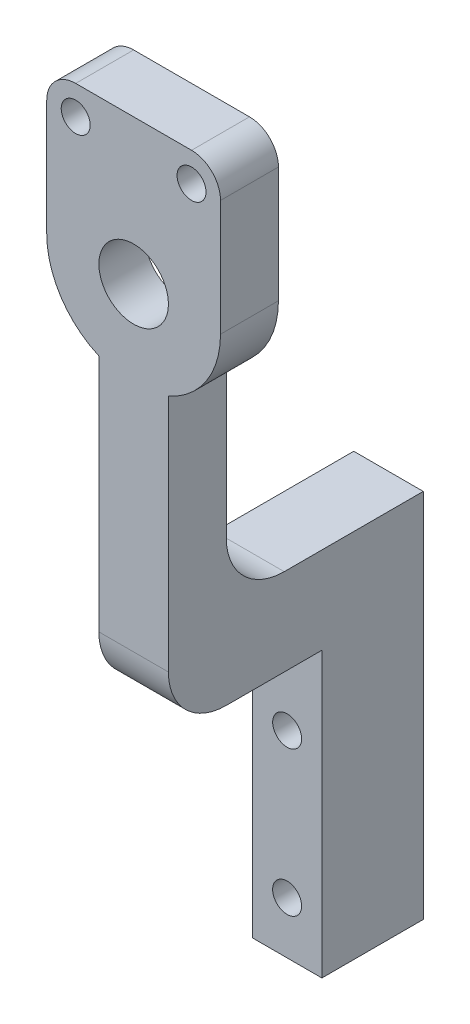
ISO-10303-21;
HEADER;
FILE_DESCRIPTION(('STEP AP214'),'2;1');
FILE_NAME('part.step','',(''),(''),'','','');
FILE_SCHEMA(('AUTOMOTIVE_DESIGN { 1 0 10303 214 1 1 1 1 }'));
ENDSEC;
DATA;
#1=APPLICATION_CONTEXT('core data for automotive mechanical design processes');
#2=APPLICATION_PROTOCOL_DEFINITION('international standard','automotive_design',2000,#1);
#3=PRODUCT_CONTEXT('',#1,'mechanical');
#4=PRODUCT('Part','Part','',(#3));
#5=PRODUCT_RELATED_PRODUCT_CATEGORY('part','',(#4));
#6=PRODUCT_DEFINITION_FORMATION('','',#4);
#7=PRODUCT_DEFINITION_CONTEXT('part definition',#1,'design');
#8=PRODUCT_DEFINITION('design','',#6,#7);
#9=PRODUCT_DEFINITION_SHAPE('','',#8);
#10=(LENGTH_UNIT() NAMED_UNIT(*) SI_UNIT(.MILLI.,.METRE.));
#11=(NAMED_UNIT(*) PLANE_ANGLE_UNIT() SI_UNIT($,.RADIAN.));
#12=(NAMED_UNIT(*) SI_UNIT($,.STERADIAN.) SOLID_ANGLE_UNIT());
#13=UNCERTAINTY_MEASURE_WITH_UNIT(LENGTH_MEASURE(1.E-05),#10,'distance_accuracy_value','');
#14=(GEOMETRIC_REPRESENTATION_CONTEXT(3) GLOBAL_UNCERTAINTY_ASSIGNED_CONTEXT((#13)) GLOBAL_UNIT_ASSIGNED_CONTEXT((#10,
#11,#12)) REPRESENTATION_CONTEXT('',''));
#15=CARTESIAN_POINT('',(0.,0.,0.));
#16=DIRECTION('',(0.,0.,1.));
#17=DIRECTION('',(1.,0.,0.));
#18=AXIS2_PLACEMENT_3D('',#15,#16,#17);
#19=CARTESIAN_POINT('',(-6.,80.,0.));
#20=DIRECTION('',(1.,0.,0.));
#21=DIRECTION('',(0.,0.,-1.));
#22=AXIS2_PLACEMENT_3D('',#19,#20,#21);
#23=PLANE('',#22);
#24=DIRECTION('',(0.,-1.,0.));
#25=VECTOR('',#24,1.);
#26=CARTESIAN_POINT('',(-6.,0.,35.));
#27=LINE('',#26,#25);
#28=CARTESIAN_POINT('',(-6.,80.,35.));
#29=VERTEX_POINT('',#28);
#30=CARTESIAN_POINT('',(-6.,16.,35.));
#31=VERTEX_POINT('',#30);
#32=EDGE_CURVE('E90',#29,#31,#27,.T.);
#33=ORIENTED_EDGE('',*,*,#32,.T.);
#34=DIRECTION('',(0.,0.,1.));
#35=VECTOR('',#34,1.);
#36=CARTESIAN_POINT('',(-6.,16.,0.));
#37=LINE('',#36,#35);
#38=CARTESIAN_POINT('',(-6.,16.,52.5));
#39=VERTEX_POINT('',#38);
#40=EDGE_CURVE('E83',#31,#39,#37,.T.);
#41=ORIENTED_EDGE('',*,*,#40,.T.);
#42=DIRECTION('',(0.,-1.,0.));
#43=VECTOR('',#42,1.);
#44=CARTESIAN_POINT('',(-6.,80.,52.5));
#45=LINE('',#44,#43);
#46=CARTESIAN_POINT('',(-6.,65.,52.5));
#47=VERTEX_POINT('',#46);
#48=EDGE_CURVE('E286',#47,#39,#45,.T.);
#49=ORIENTED_EDGE('',*,*,#48,.F.);
#50=DIRECTION('',(0.,0.,-1.));
#51=VECTOR('',#50,1.);
#52=CARTESIAN_POINT('',(-6.,65.,0.));
#53=LINE('',#52,#51);
#54=CARTESIAN_POINT('',(-6.,65.,68.9999999999999));
#55=VERTEX_POINT('',#54);
#56=EDGE_CURVE('E244',#55,#47,#53,.T.);
#57=ORIENTED_EDGE('',*,*,#56,.F.);
#58=CARTESIAN_POINT('',(-6.,75.,69.));
#59=DIRECTION('',(-1.,0.,0.));
#60=DIRECTION('',(0.,0.,1.));
#61=AXIS2_PLACEMENT_3D('',#58,#59,#60);
#62=CIRCLE('',#61,9.99999999999999);
#63=CARTESIAN_POINT('',(-6.,75.0000000000001,79.));
#64=VERTEX_POINT('',#63);
#65=EDGE_CURVE('E238',#64,#55,#62,.F.);
#66=ORIENTED_EDGE('',*,*,#65,.F.);
#67=DIRECTION('',(0.,-1.,0.));
#68=VECTOR('',#67,1.);
#69=CARTESIAN_POINT('',(-6.,0.,79.));
#70=LINE('',#69,#68);
#71=CARTESIAN_POINT('',(-6.,116.252272915133,79.));
#72=VERTEX_POINT('',#71);
#73=EDGE_CURVE('E204',#72,#64,#70,.T.);
#74=ORIENTED_EDGE('',*,*,#73,.F.);
#75=DIRECTION('',(0.,0.,-1.));
#76=VECTOR('',#75,1.);
#77=CARTESIAN_POINT('',(-6.,116.252272915133,120.550352736722));
#78=LINE('',#77,#76);
#79=CARTESIAN_POINT('',(-6.,116.252272915133,69.));
#80=VERTEX_POINT('',#79);
#81=EDGE_CURVE('E201',#72,#80,#78,.T.);
#82=ORIENTED_EDGE('',*,*,#81,.T.);
#83=DIRECTION('',(0.,1.,0.));
#84=VECTOR('',#83,1.);
#85=CARTESIAN_POINT('',(-6.,0.,69.));
#86=LINE('',#85,#84);
#87=CARTESIAN_POINT('',(-6.,90.0000000000001,69.));
#88=VERTEX_POINT('',#87);
#89=EDGE_CURVE('E261',#88,#80,#86,.T.);
#90=ORIENTED_EDGE('',*,*,#89,.F.);
#91=CARTESIAN_POINT('',(-6.,90.,59.));
#92=DIRECTION('',(-1.,0.,0.));
#93=DIRECTION('',(0.,0.,1.));
#94=AXIS2_PLACEMENT_3D('',#91,#92,#93);
#95=CIRCLE('',#94,10.);
#96=CARTESIAN_POINT('',(-6.,80.,59.));
#97=VERTEX_POINT('',#96);
#98=EDGE_CURVE('E258',#88,#97,#95,.F.);
#99=ORIENTED_EDGE('',*,*,#98,.T.);
#100=DIRECTION('',(0.,0.,1.));
#101=VECTOR('',#100,1.);
#102=CARTESIAN_POINT('',(-6.,80.,0.));
#103=LINE('',#102,#101);
#104=EDGE_CURVE('E294',#29,#97,#103,.T.);
#105=ORIENTED_EDGE('',*,*,#104,.F.);
#106=EDGE_LOOP('',(#33,#41,#49,#57,#66,#74,#82,#90,#99,#105));
#107=FACE_BOUND('',#106,.T.);
#108=ADVANCED_FACE('F68',(#107),#23,.F.);
#109=CARTESIAN_POINT('',(6.,80.,0.));
#110=DIRECTION('',(-1.,0.,0.));
#111=DIRECTION('',(0.,0.,1.));
#112=AXIS2_PLACEMENT_3D('',#109,#110,#111);
#113=PLANE('',#112);
#114=DIRECTION('',(0.,-1.,0.));
#115=VECTOR('',#114,1.);
#116=CARTESIAN_POINT('',(6.,80.,52.5));
#117=LINE('',#116,#115);
#118=CARTESIAN_POINT('',(6.00000000000001,65.,52.5));
#119=VERTEX_POINT('',#118);
#120=CARTESIAN_POINT('',(6.,16.,52.5));
#121=VERTEX_POINT('',#120);
#122=EDGE_CURVE('E305',#119,#121,#117,.T.);
#123=ORIENTED_EDGE('',*,*,#122,.T.);
#124=DIRECTION('',(0.,0.,-1.));
#125=VECTOR('',#124,1.);
#126=CARTESIAN_POINT('',(6.,16.,0.));
#127=LINE('',#126,#125);
#128=CARTESIAN_POINT('',(6.,16.,35.));
#129=VERTEX_POINT('',#128);
#130=EDGE_CURVE('E389',#121,#129,#127,.T.);
#131=ORIENTED_EDGE('',*,*,#130,.T.);
#132=DIRECTION('',(0.,-1.,0.));
#133=VECTOR('',#132,1.);
#134=CARTESIAN_POINT('',(6.,0.,35.));
#135=LINE('',#134,#133);
#136=CARTESIAN_POINT('',(6.,80.,35.));
#137=VERTEX_POINT('',#136);
#138=EDGE_CURVE('E76',#137,#129,#135,.T.);
#139=ORIENTED_EDGE('',*,*,#138,.F.);
#140=DIRECTION('',(0.,0.,-1.));
#141=VECTOR('',#140,1.);
#142=CARTESIAN_POINT('',(6.,80.,0.));
#143=LINE('',#142,#141);
#144=CARTESIAN_POINT('',(6.00000000000001,80.,59.));
#145=VERTEX_POINT('',#144);
#146=EDGE_CURVE('E386',#145,#137,#143,.T.);
#147=ORIENTED_EDGE('',*,*,#146,.F.);
#148=CARTESIAN_POINT('',(6.00000000000001,90.,59.));
#149=DIRECTION('',(-1.,0.,0.));
#150=DIRECTION('',(0.,0.,1.));
#151=AXIS2_PLACEMENT_3D('',#148,#149,#150);
#152=CIRCLE('',#151,10.);
#153=CARTESIAN_POINT('',(6.00000000000001,90.,69.));
#154=VERTEX_POINT('',#153);
#155=EDGE_CURVE('E277',#145,#154,#152,.T.);
#156=ORIENTED_EDGE('',*,*,#155,.T.);
#157=DIRECTION('',(0.,-1.,0.));
#158=VECTOR('',#157,1.);
#159=CARTESIAN_POINT('',(6.00000000000001,0.,69.));
#160=LINE('',#159,#158);
#161=CARTESIAN_POINT('',(6.00000000000001,116.252272915133,69.));
#162=VERTEX_POINT('',#161);
#163=EDGE_CURVE('E229',#162,#154,#160,.T.);
#164=ORIENTED_EDGE('',*,*,#163,.F.);
#165=DIRECTION('',(0.,0.,-1.));
#166=VECTOR('',#165,1.);
#167=CARTESIAN_POINT('',(6.00000000000001,116.252272915133,120.550352736722));
#168=LINE('',#167,#166);
#169=CARTESIAN_POINT('',(6.00000000000001,116.252272915133,79.));
#170=VERTEX_POINT('',#169);
#171=EDGE_CURVE('E287',#170,#162,#168,.T.);
#172=ORIENTED_EDGE('',*,*,#171,.F.);
#173=DIRECTION('',(0.,1.,0.));
#174=VECTOR('',#173,1.);
#175=CARTESIAN_POINT('',(6.00000000000001,0.,79.));
#176=LINE('',#175,#174);
#177=CARTESIAN_POINT('',(6.00000000000001,75.,79.));
#178=VERTEX_POINT('',#177);
#179=EDGE_CURVE('E209',#178,#170,#176,.T.);
#180=ORIENTED_EDGE('',*,*,#179,.F.);
#181=CARTESIAN_POINT('',(6.00000000000001,75.,69.));
#182=DIRECTION('',(-1.,0.,0.));
#183=DIRECTION('',(0.,0.,1.));
#184=AXIS2_PLACEMENT_3D('',#181,#182,#183);
#185=CIRCLE('',#184,9.99999999999999);
#186=CARTESIAN_POINT('',(6.00000000000001,65.,68.9999999999999));
#187=VERTEX_POINT('',#186);
#188=EDGE_CURVE('E223',#187,#178,#185,.T.);
#189=ORIENTED_EDGE('',*,*,#188,.F.);
#190=DIRECTION('',(0.,0.,1.));
#191=VECTOR('',#190,1.);
#192=CARTESIAN_POINT('',(6.00000000000001,65.,0.));
#193=LINE('',#192,#191);
#194=EDGE_CURVE('E234',#119,#187,#193,.T.);
#195=ORIENTED_EDGE('',*,*,#194,.F.);
#196=EDGE_LOOP('',(#123,#131,#139,#147,#156,#164,#172,#180,#189,#195));
#197=FACE_BOUND('',#196,.T.);
#198=ADVANCED_FACE('F384',(#197),#113,.F.);
#199=CARTESIAN_POINT('',(0.,130.,120.550352736722));
#200=DIRECTION('',(0.,0.,-1.));
#201=DIRECTION('',(-1.,0.,0.));
#202=AXIS2_PLACEMENT_3D('',#199,#200,#201);
#203=CYLINDRICAL_SURFACE('',#202,15.);
#204=CARTESIAN_POINT('',(0.,130.,69.));
#205=DIRECTION('',(0.,0.,-1.));
#206=DIRECTION('',(-1.,0.,0.));
#207=AXIS2_PLACEMENT_3D('',#204,#205,#206);
#208=CIRCLE('',#207,15.);
#209=CARTESIAN_POINT('',(15.,130.,69.));
#210=VERTEX_POINT('',#209);
#211=EDGE_CURVE('E271',#210,#162,#208,.T.);
#212=ORIENTED_EDGE('',*,*,#211,.F.);
#213=DIRECTION('',(0.,0.,1.));
#214=VECTOR('',#213,1.);
#215=CARTESIAN_POINT('',(15.,130.,29.9487516204667));
#216=LINE('',#215,#214);
#217=CARTESIAN_POINT('',(15.,130.,79.));
#218=VERTEX_POINT('',#217);
#219=EDGE_CURVE('E297',#210,#218,#216,.T.);
#220=ORIENTED_EDGE('',*,*,#219,.T.);
#221=CARTESIAN_POINT('',(0.,130.,79.));
#222=DIRECTION('',(0.,0.,-1.));
#223=DIRECTION('',(0.,1.,0.));
#224=AXIS2_PLACEMENT_3D('',#221,#222,#223);
#225=CIRCLE('',#224,15.);
#226=EDGE_CURVE('E206',#170,#218,#225,.F.);
#227=ORIENTED_EDGE('',*,*,#226,.F.);
#228=ORIENTED_EDGE('',*,*,#171,.T.);
#229=EDGE_LOOP('',(#212,#220,#227,#228));
#230=FACE_BOUND('',#229,.T.);
#231=ADVANCED_FACE('F449',(#230),#203,.T.);
#232=CARTESIAN_POINT('',(0.,80.,52.5));
#233=DIRECTION('',(0.,0.,-1.));
#234=DIRECTION('',(-1.,0.,0.));
#235=AXIS2_PLACEMENT_3D('',#232,#233,#234);
#236=PLANE('',#235);
#237=CARTESIAN_POINT('',(0.,25.,52.5));
#238=DIRECTION('',(0.,0.,-1.));
#239=DIRECTION('',(-1.,0.,0.));
#240=AXIS2_PLACEMENT_3D('',#237,#238,#239);
#241=CIRCLE('',#240,2.5);
#242=CARTESIAN_POINT('',(-2.5,25.,52.5));
#243=VERTEX_POINT('',#242);
#244=EDGE_CURVE('E361',#243,#243,#241,.F.);
#245=ORIENTED_EDGE('',*,*,#244,.F.);
#246=EDGE_LOOP('',(#245));
#247=FACE_BOUND('',#246,.T.);
#248=CARTESIAN_POINT('',(0.,50.,52.5));
#249=DIRECTION('',(0.,0.,-1.));
#250=DIRECTION('',(-1.,0.,0.));
#251=AXIS2_PLACEMENT_3D('',#248,#249,#250);
#252=CIRCLE('',#251,2.5);
#253=CARTESIAN_POINT('',(-2.5,50.,52.5));
#254=VERTEX_POINT('',#253);
#255=EDGE_CURVE('E356',#254,#254,#252,.F.);
#256=ORIENTED_EDGE('',*,*,#255,.F.);
#257=EDGE_LOOP('',(#256));
#258=FACE_BOUND('',#257,.T.);
#259=ORIENTED_EDGE('',*,*,#48,.T.);
#260=DIRECTION('',(1.,0.,0.));
#261=VECTOR('',#260,1.);
#262=CARTESIAN_POINT('',(0.,16.,52.5));
#263=LINE('',#262,#261);
#264=EDGE_CURVE('E419',#39,#121,#263,.T.);
#265=ORIENTED_EDGE('',*,*,#264,.T.);
#266=ORIENTED_EDGE('',*,*,#122,.F.);
#267=DIRECTION('',(-1.,0.,0.));
#268=VECTOR('',#267,1.);
#269=CARTESIAN_POINT('',(76.1943729938519,65.,52.5));
#270=LINE('',#269,#268);
#271=EDGE_CURVE('E283',#119,#47,#270,.T.);
#272=ORIENTED_EDGE('',*,*,#271,.T.);
#273=EDGE_LOOP('',(#259,#265,#266,#272));
#274=FACE_BOUND('',#273,.T.);
#275=ADVANCED_FACE('F434',(#247,#258,#274),#236,.F.);
#276=CARTESIAN_POINT('',(0.,80.,0.));
#277=DIRECTION('',(0.,1.,0.));
#278=DIRECTION('',(0.,0.,1.));
#279=AXIS2_PLACEMENT_3D('',#276,#277,#278);
#280=PLANE('',#279);
#281=DIRECTION('',(1.,0.,0.));
#282=VECTOR('',#281,1.);
#283=CARTESIAN_POINT('',(0.,80.,35.));
#284=LINE('',#283,#282);
#285=EDGE_CURVE('E365',#29,#137,#284,.T.);
#286=ORIENTED_EDGE('',*,*,#285,.F.);
#287=ORIENTED_EDGE('',*,*,#104,.T.);
#288=DIRECTION('',(-1.,0.,0.));
#289=VECTOR('',#288,1.);
#290=CARTESIAN_POINT('',(76.1943729938519,80.,59.));
#291=LINE('',#290,#289);
#292=EDGE_CURVE('E257',#145,#97,#291,.T.);
#293=ORIENTED_EDGE('',*,*,#292,.F.);
#294=ORIENTED_EDGE('',*,*,#146,.T.);
#295=EDGE_LOOP('',(#286,#287,#293,#294));
#296=FACE_BOUND('',#295,.T.);
#297=ADVANCED_FACE('F391',(#296),#280,.T.);
#298=CARTESIAN_POINT('',(76.1943729938519,0.,69.));
#299=DIRECTION('',(0.,0.,1.));
#300=DIRECTION('',(1.,0.,0.));
#301=AXIS2_PLACEMENT_3D('',#298,#299,#300);
#302=PLANE('',#301);
#303=CARTESIAN_POINT('',(-9.99999999999998,150.,69.));
#304=DIRECTION('',(0.,0.,1.));
#305=DIRECTION('',(1.,0.,0.));
#306=AXIS2_PLACEMENT_3D('',#303,#304,#305);
#307=CIRCLE('',#306,2.5);
#308=CARTESIAN_POINT('',(-7.49999999999998,150.,69.));
#309=VERTEX_POINT('',#308);
#310=EDGE_CURVE('E347',#309,#309,#307,.F.);
#311=ORIENTED_EDGE('',*,*,#310,.F.);
#312=EDGE_LOOP('',(#311));
#313=FACE_BOUND('',#312,.T.);
#314=CARTESIAN_POINT('',(9.99999999999999,150.,69.));
#315=DIRECTION('',(0.,0.,1.));
#316=DIRECTION('',(1.,0.,0.));
#317=AXIS2_PLACEMENT_3D('',#314,#315,#316);
#318=CIRCLE('',#317,2.5);
#319=CARTESIAN_POINT('',(12.5,150.,69.));
#320=VERTEX_POINT('',#319);
#321=EDGE_CURVE('E333',#320,#320,#318,.F.);
#322=ORIENTED_EDGE('',*,*,#321,.F.);
#323=EDGE_LOOP('',(#322));
#324=FACE_BOUND('',#323,.T.);
#325=CARTESIAN_POINT('',(0.,130.,69.));
#326=DIRECTION('',(0.,0.,-1.));
#327=DIRECTION('',(-1.,0.,0.));
#328=AXIS2_PLACEMENT_3D('',#325,#326,#327);
#329=CIRCLE('',#328,9.50000000000001);
#330=CARTESIAN_POINT('',(-9.5,130.,69.));
#331=VERTEX_POINT('',#330);
#332=EDGE_CURVE('E282',#331,#331,#329,.T.);
#333=ORIENTED_EDGE('',*,*,#332,.F.);
#334=EDGE_LOOP('',(#333));
#335=FACE_BOUND('',#334,.T.);
#336=DIRECTION('',(0.,-1.,0.));
#337=VECTOR('',#336,1.);
#338=CARTESIAN_POINT('',(-15.,0.,69.));
#339=LINE('',#338,#337);
#340=CARTESIAN_POINT('',(-15.,150.,69.));
#341=VERTEX_POINT('',#340);
#342=CARTESIAN_POINT('',(-15.,130.,69.));
#343=VERTEX_POINT('',#342);
#344=EDGE_CURVE('E182',#341,#343,#339,.T.);
#345=ORIENTED_EDGE('',*,*,#344,.F.);
#346=CARTESIAN_POINT('',(-9.99999999999998,150.,69.));
#347=DIRECTION('',(0.,0.,1.));
#348=DIRECTION('',(1.,0.,0.));
#349=AXIS2_PLACEMENT_3D('',#346,#347,#348);
#350=CIRCLE('',#349,5.);
#351=CARTESIAN_POINT('',(-9.99999999999998,155.,69.));
#352=VERTEX_POINT('',#351);
#353=EDGE_CURVE('E395',#341,#352,#350,.F.);
#354=ORIENTED_EDGE('',*,*,#353,.T.);
#355=DIRECTION('',(-1.,0.,0.));
#356=VECTOR('',#355,1.);
#357=CARTESIAN_POINT('',(0.,155.,69.));
#358=LINE('',#357,#356);
#359=CARTESIAN_POINT('',(9.99999999999998,155.,69.));
#360=VERTEX_POINT('',#359);
#361=EDGE_CURVE('E319',#360,#352,#358,.T.);
#362=ORIENTED_EDGE('',*,*,#361,.F.);
#363=CARTESIAN_POINT('',(9.99999999999998,150.,69.));
#364=DIRECTION('',(0.,0.,1.));
#365=DIRECTION('',(1.,0.,0.));
#366=AXIS2_PLACEMENT_3D('',#363,#364,#365);
#367=CIRCLE('',#366,5.);
#368=CARTESIAN_POINT('',(15.,150.,69.));
#369=VERTEX_POINT('',#368);
#370=EDGE_CURVE('E399',#360,#369,#367,.F.);
#371=ORIENTED_EDGE('',*,*,#370,.T.);
#372=DIRECTION('',(0.,1.,0.));
#373=VECTOR('',#372,1.);
#374=CARTESIAN_POINT('',(15.,0.,69.));
#375=LINE('',#374,#373);
#376=EDGE_CURVE('E187',#210,#369,#375,.T.);
#377=ORIENTED_EDGE('',*,*,#376,.F.);
#378=ORIENTED_EDGE('',*,*,#211,.T.);
#379=ORIENTED_EDGE('',*,*,#163,.T.);
#380=DIRECTION('',(-1.,0.,0.));
#381=VECTOR('',#380,1.);
#382=CARTESIAN_POINT('',(76.1943729938519,90.0000000000001,69.));
#383=LINE('',#382,#381);
#384=EDGE_CURVE('E265',#154,#88,#383,.T.);
#385=ORIENTED_EDGE('',*,*,#384,.T.);
#386=ORIENTED_EDGE('',*,*,#89,.T.);
#387=EDGE_CURVE('E264',#80,#343,#208,.T.);
#388=ORIENTED_EDGE('',*,*,#387,.T.);
#389=EDGE_LOOP('',(#345,#354,#362,#371,#377,#378,#379,#385,#386,#388));
#390=FACE_BOUND('',#389,.T.);
#391=ADVANCED_FACE('F497',(#313,#324,#335,#390),#302,.F.);
#392=CARTESIAN_POINT('',(76.1943729938519,0.,79.));
#393=DIRECTION('',(0.,0.,-1.));
#394=DIRECTION('',(0.,1.,0.));
#395=AXIS2_PLACEMENT_3D('',#392,#393,#394);
#396=PLANE('',#395);
#397=CARTESIAN_POINT('',(-9.99999999999998,150.,79.));
#398=DIRECTION('',(0.,0.,1.));
#399=DIRECTION('',(1.,0.,0.));
#400=AXIS2_PLACEMENT_3D('',#397,#398,#399);
#401=CIRCLE('',#400,2.5);
#402=CARTESIAN_POINT('',(-7.49999999999998,150.,79.));
#403=VERTEX_POINT('',#402);
#404=EDGE_CURVE('E351',#403,#403,#401,.T.);
#405=ORIENTED_EDGE('',*,*,#404,.F.);
#406=EDGE_LOOP('',(#405));
#407=FACE_BOUND('',#406,.T.);
#408=CARTESIAN_POINT('',(9.99999999999999,150.,79.));
#409=DIRECTION('',(0.,0.,1.));
#410=DIRECTION('',(1.,0.,0.));
#411=AXIS2_PLACEMENT_3D('',#408,#409,#410);
#412=CIRCLE('',#411,2.5);
#413=CARTESIAN_POINT('',(12.5,150.,79.));
#414=VERTEX_POINT('',#413);
#415=EDGE_CURVE('E343',#414,#414,#412,.T.);
#416=ORIENTED_EDGE('',*,*,#415,.F.);
#417=EDGE_LOOP('',(#416));
#418=FACE_BOUND('',#417,.T.);
#419=CARTESIAN_POINT('',(0.,130.,79.));
#420=DIRECTION('',(0.,0.,-1.));
#421=DIRECTION('',(-1.,0.,0.));
#422=AXIS2_PLACEMENT_3D('',#419,#420,#421);
#423=CIRCLE('',#422,6.);
#424=CARTESIAN_POINT('',(-6.,130.,79.));
#425=VERTEX_POINT('',#424);
#426=EDGE_CURVE('E211',#425,#425,#423,.T.);
#427=ORIENTED_EDGE('',*,*,#426,.T.);
#428=EDGE_LOOP('',(#427));
#429=FACE_BOUND('',#428,.T.);
#430=DIRECTION('',(1.,0.,0.));
#431=VECTOR('',#430,1.);
#432=CARTESIAN_POINT('',(0.,155.,79.));
#433=LINE('',#432,#431);
#434=CARTESIAN_POINT('',(-9.99999999999998,155.,79.));
#435=VERTEX_POINT('',#434);
#436=CARTESIAN_POINT('',(9.99999999999998,155.,79.));
#437=VERTEX_POINT('',#436);
#438=EDGE_CURVE('E327',#435,#437,#433,.T.);
#439=ORIENTED_EDGE('',*,*,#438,.F.);
#440=CARTESIAN_POINT('',(-9.99999999999998,150.,79.));
#441=DIRECTION('',(0.,0.,-1.));
#442=DIRECTION('',(0.,1.,0.));
#443=AXIS2_PLACEMENT_3D('',#440,#441,#442);
#444=CIRCLE('',#443,5.);
#445=CARTESIAN_POINT('',(-15.,150.,79.));
#446=VERTEX_POINT('',#445);
#447=EDGE_CURVE('E194',#435,#446,#444,.F.);
#448=ORIENTED_EDGE('',*,*,#447,.T.);
#449=DIRECTION('',(0.,1.,0.));
#450=VECTOR('',#449,1.);
#451=CARTESIAN_POINT('',(-15.,0.,79.));
#452=LINE('',#451,#450);
#453=CARTESIAN_POINT('',(-15.,130.,79.));
#454=VERTEX_POINT('',#453);
#455=EDGE_CURVE('E179',#454,#446,#452,.T.);
#456=ORIENTED_EDGE('',*,*,#455,.F.);
#457=EDGE_CURVE('E192',#454,#72,#225,.F.);
#458=ORIENTED_EDGE('',*,*,#457,.T.);
#459=ORIENTED_EDGE('',*,*,#73,.T.);
#460=DIRECTION('',(-1.,0.,0.));
#461=VECTOR('',#460,1.);
#462=CARTESIAN_POINT('',(76.1943729938519,75.0000000000001,79.));
#463=LINE('',#462,#461);
#464=EDGE_CURVE('E233',#178,#64,#463,.T.);
#465=ORIENTED_EDGE('',*,*,#464,.F.);
#466=ORIENTED_EDGE('',*,*,#179,.T.);
#467=ORIENTED_EDGE('',*,*,#226,.T.);
#468=DIRECTION('',(0.,-1.,0.));
#469=VECTOR('',#468,1.);
#470=CARTESIAN_POINT('',(15.,0.,79.));
#471=LINE('',#470,#469);
#472=CARTESIAN_POINT('',(15.,150.,79.));
#473=VERTEX_POINT('',#472);
#474=EDGE_CURVE('E330',#473,#218,#471,.T.);
#475=ORIENTED_EDGE('',*,*,#474,.F.);
#476=CARTESIAN_POINT('',(9.99999999999998,150.,79.));
#477=DIRECTION('',(0.,0.,-1.));
#478=DIRECTION('',(0.,1.,0.));
#479=AXIS2_PLACEMENT_3D('',#476,#477,#478);
#480=CIRCLE('',#479,5.);
#481=EDGE_CURVE('E217',#473,#437,#480,.F.);
#482=ORIENTED_EDGE('',*,*,#481,.T.);
#483=EDGE_LOOP('',(#439,#448,#456,#458,#459,#465,#466,#467,#475,#482));
#484=FACE_BOUND('',#483,.T.);
#485=ADVANCED_FACE('F191',(#407,#418,#429,#484),#396,.F.);
#486=CARTESIAN_POINT('',(76.1943729938519,75.,69.));
#487=DIRECTION('',(-1.,0.,0.));
#488=DIRECTION('',(0.,0.,1.));
#489=AXIS2_PLACEMENT_3D('',#486,#487,#488);
#490=CYLINDRICAL_SURFACE('',#489,9.99999999999999);
#491=DIRECTION('',(-1.,0.,0.));
#492=VECTOR('',#491,1.);
#493=CARTESIAN_POINT('',(76.1943729938519,65.,68.9999999999999));
#494=LINE('',#493,#492);
#495=EDGE_CURVE('E237',#187,#55,#494,.T.);
#496=ORIENTED_EDGE('',*,*,#495,.F.);
#497=ORIENTED_EDGE('',*,*,#188,.T.);
#498=ORIENTED_EDGE('',*,*,#464,.T.);
#499=ORIENTED_EDGE('',*,*,#65,.T.);
#500=EDGE_LOOP('',(#496,#497,#498,#499));
#501=FACE_BOUND('',#500,.T.);
#502=ADVANCED_FACE('F432',(#501),#490,.T.);
#503=CARTESIAN_POINT('',(76.1943729938519,65.,0.));
#504=DIRECTION('',(0.,1.,0.));
#505=DIRECTION('',(0.,0.,1.));
#506=AXIS2_PLACEMENT_3D('',#503,#504,#505);
#507=PLANE('',#506);
#508=ORIENTED_EDGE('',*,*,#271,.F.);
#509=ORIENTED_EDGE('',*,*,#194,.T.);
#510=ORIENTED_EDGE('',*,*,#495,.T.);
#511=ORIENTED_EDGE('',*,*,#56,.T.);
#512=EDGE_LOOP('',(#508,#509,#510,#511));
#513=FACE_BOUND('',#512,.T.);
#514=ADVANCED_FACE('F433',(#513),#507,.F.);
#515=CARTESIAN_POINT('',(76.1943729938519,90.,59.));
#516=DIRECTION('',(-1.,0.,0.));
#517=DIRECTION('',(0.,0.,1.));
#518=AXIS2_PLACEMENT_3D('',#515,#516,#517);
#519=CYLINDRICAL_SURFACE('',#518,10.);
#520=ORIENTED_EDGE('',*,*,#155,.F.);
#521=ORIENTED_EDGE('',*,*,#292,.T.);
#522=ORIENTED_EDGE('',*,*,#98,.F.);
#523=ORIENTED_EDGE('',*,*,#384,.F.);
#524=EDGE_LOOP('',(#520,#521,#522,#523));
#525=FACE_BOUND('',#524,.T.);
#526=ADVANCED_FACE('F430',(#525),#519,.F.);
#527=DIRECTION('',(0.,0.,1.));
#528=VECTOR('',#527,1.);
#529=CARTESIAN_POINT('',(-15.,130.,29.9487516204667));
#530=LINE('',#529,#528);
#531=EDGE_CURVE('E176',#343,#454,#530,.T.);
#532=ORIENTED_EDGE('',*,*,#531,.F.);
#533=ORIENTED_EDGE('',*,*,#387,.F.);
#534=ORIENTED_EDGE('',*,*,#81,.F.);
#535=ORIENTED_EDGE('',*,*,#457,.F.);
#536=EDGE_LOOP('',(#532,#533,#534,#535));
#537=FACE_BOUND('',#536,.T.);
#538=ADVANCED_FACE('F199',(#537),#203,.T.);
#539=CARTESIAN_POINT('',(0.,130.,71.));
#540=DIRECTION('',(0.,0.,-1.));
#541=DIRECTION('',(-1.,0.,0.));
#542=AXIS2_PLACEMENT_3D('',#539,#540,#541);
#543=CYLINDRICAL_SURFACE('',#542,9.50000000000001);
#544=CARTESIAN_POINT('',(0.,130.,71.));
#545=DIRECTION('',(0.,0.,-1.));
#546=DIRECTION('',(-1.,0.,0.));
#547=AXIS2_PLACEMENT_3D('',#544,#545,#546);
#548=CIRCLE('',#547,9.50000000000001);
#549=CARTESIAN_POINT('',(-9.5,130.,71.));
#550=VERTEX_POINT('',#549);
#551=EDGE_CURVE('E311',#550,#550,#548,.T.);
#552=ORIENTED_EDGE('',*,*,#551,.F.);
#553=EDGE_LOOP('',(#552));
#554=FACE_BOUND('',#553,.T.);
#555=ORIENTED_EDGE('',*,*,#332,.T.);
#556=EDGE_LOOP('',(#555));
#557=FACE_BOUND('',#556,.T.);
#558=ADVANCED_FACE('F489',(#554,#557),#543,.F.);
#559=CARTESIAN_POINT('',(0.,0.,71.));
#560=DIRECTION('',(0.,0.,-1.));
#561=DIRECTION('',(-1.,0.,0.));
#562=AXIS2_PLACEMENT_3D('',#559,#560,#561);
#563=PLANE('',#562);
#564=CARTESIAN_POINT('',(0.,130.,71.));
#565=DIRECTION('',(0.,0.,-1.));
#566=DIRECTION('',(-1.,0.,0.));
#567=AXIS2_PLACEMENT_3D('',#564,#565,#566);
#568=CIRCLE('',#567,6.);
#569=CARTESIAN_POINT('',(-6.,130.,71.));
#570=VERTEX_POINT('',#569);
#571=EDGE_CURVE('E315',#570,#570,#568,.T.);
#572=ORIENTED_EDGE('',*,*,#571,.F.);
#573=EDGE_LOOP('',(#572));
#574=FACE_BOUND('',#573,.T.);
#575=ORIENTED_EDGE('',*,*,#551,.T.);
#576=EDGE_LOOP('',(#575));
#577=FACE_BOUND('',#576,.T.);
#578=ADVANCED_FACE('F485',(#574,#577),#563,.T.);
#579=CARTESIAN_POINT('',(0.,130.,79.));
#580=DIRECTION('',(0.,0.,-1.));
#581=DIRECTION('',(-1.,0.,0.));
#582=AXIS2_PLACEMENT_3D('',#579,#580,#581);
#583=CYLINDRICAL_SURFACE('',#582,6.);
#584=ORIENTED_EDGE('',*,*,#426,.F.);
#585=EDGE_LOOP('',(#584));
#586=FACE_BOUND('',#585,.T.);
#587=ORIENTED_EDGE('',*,*,#571,.T.);
#588=EDGE_LOOP('',(#587));
#589=FACE_BOUND('',#588,.T.);
#590=ADVANCED_FACE('F478',(#586,#589),#583,.F.);
#591=CARTESIAN_POINT('',(0.,155.,29.9487516204667));
#592=DIRECTION('',(0.,-1.,0.));
#593=DIRECTION('',(0.,0.,-1.));
#594=AXIS2_PLACEMENT_3D('',#591,#592,#593);
#595=PLANE('',#594);
#596=ORIENTED_EDGE('',*,*,#361,.T.);
#597=DIRECTION('',(0.,0.,1.));
#598=VECTOR('',#597,1.);
#599=CARTESIAN_POINT('',(-9.99999999999998,155.,29.9487516204667));
#600=LINE('',#599,#598);
#601=EDGE_CURVE('E325',#352,#435,#600,.T.);
#602=ORIENTED_EDGE('',*,*,#601,.T.);
#603=ORIENTED_EDGE('',*,*,#438,.T.);
#604=DIRECTION('',(0.,0.,1.));
#605=VECTOR('',#604,1.);
#606=CARTESIAN_POINT('',(9.99999999999998,155.,29.9487516204667));
#607=LINE('',#606,#605);
#608=EDGE_CURVE('E197',#437,#360,#607,.F.);
#609=ORIENTED_EDGE('',*,*,#608,.T.);
#610=EDGE_LOOP('',(#596,#602,#603,#609));
#611=FACE_BOUND('',#610,.T.);
#612=ADVANCED_FACE('F475',(#611),#595,.F.);
#613=CARTESIAN_POINT('',(-15.,0.,29.9487516204667));
#614=DIRECTION('',(1.,0.,0.));
#615=DIRECTION('',(0.,0.,-1.));
#616=AXIS2_PLACEMENT_3D('',#613,#614,#615);
#617=PLANE('',#616);
#618=ORIENTED_EDGE('',*,*,#455,.T.);
#619=DIRECTION('',(0.,0.,1.));
#620=VECTOR('',#619,1.);
#621=CARTESIAN_POINT('',(-15.,150.,29.9487516204667));
#622=LINE('',#621,#620);
#623=EDGE_CURVE('E196',#446,#341,#622,.F.);
#624=ORIENTED_EDGE('',*,*,#623,.T.);
#625=ORIENTED_EDGE('',*,*,#344,.T.);
#626=ORIENTED_EDGE('',*,*,#531,.T.);
#627=EDGE_LOOP('',(#618,#624,#625,#626));
#628=FACE_BOUND('',#627,.T.);
#629=ADVANCED_FACE('F178',(#628),#617,.F.);
#630=CARTESIAN_POINT('',(15.,0.,29.9487516204667));
#631=DIRECTION('',(-1.,0.,0.));
#632=DIRECTION('',(0.,-1.,0.));
#633=AXIS2_PLACEMENT_3D('',#630,#631,#632);
#634=PLANE('',#633);
#635=ORIENTED_EDGE('',*,*,#376,.T.);
#636=DIRECTION('',(0.,0.,1.));
#637=VECTOR('',#636,1.);
#638=CARTESIAN_POINT('',(15.,150.,29.9487516204667));
#639=LINE('',#638,#637);
#640=EDGE_CURVE('E334',#369,#473,#639,.T.);
#641=ORIENTED_EDGE('',*,*,#640,.T.);
#642=ORIENTED_EDGE('',*,*,#474,.T.);
#643=ORIENTED_EDGE('',*,*,#219,.F.);
#644=EDGE_LOOP('',(#635,#641,#642,#643));
#645=FACE_BOUND('',#644,.T.);
#646=ADVANCED_FACE('F471',(#645),#634,.F.);
#647=CARTESIAN_POINT('',(9.99999999999999,150.,61.9289321881345));
#648=DIRECTION('',(0.,0.,1.));
#649=DIRECTION('',(1.,0.,0.));
#650=AXIS2_PLACEMENT_3D('',#647,#648,#649);
#651=CYLINDRICAL_SURFACE('',#650,2.5);
#652=ORIENTED_EDGE('',*,*,#321,.T.);
#653=EDGE_LOOP('',(#652));
#654=FACE_BOUND('',#653,.T.);
#655=ORIENTED_EDGE('',*,*,#415,.T.);
#656=EDGE_LOOP('',(#655));
#657=FACE_BOUND('',#656,.T.);
#658=ADVANCED_FACE('F467',(#654,#657),#651,.F.);
#659=CARTESIAN_POINT('',(9.99999999999998,150.,29.9487516204667));
#660=DIRECTION('',(0.,0.,1.));
#661=DIRECTION('',(1.,0.,0.));
#662=AXIS2_PLACEMENT_3D('',#659,#660,#661);
#663=CYLINDRICAL_SURFACE('',#662,5.);
#664=ORIENTED_EDGE('',*,*,#370,.F.);
#665=ORIENTED_EDGE('',*,*,#608,.F.);
#666=ORIENTED_EDGE('',*,*,#481,.F.);
#667=ORIENTED_EDGE('',*,*,#640,.F.);
#668=EDGE_LOOP('',(#664,#665,#666,#667));
#669=FACE_BOUND('',#668,.T.);
#670=ADVANCED_FACE('F470',(#669),#663,.T.);
#671=CARTESIAN_POINT('',(-9.99999999999998,150.,29.9487516204667));
#672=DIRECTION('',(0.,0.,1.));
#673=DIRECTION('',(1.,0.,0.));
#674=AXIS2_PLACEMENT_3D('',#671,#672,#673);
#675=CYLINDRICAL_SURFACE('',#674,5.);
#676=ORIENTED_EDGE('',*,*,#353,.F.);
#677=ORIENTED_EDGE('',*,*,#623,.F.);
#678=ORIENTED_EDGE('',*,*,#447,.F.);
#679=ORIENTED_EDGE('',*,*,#601,.F.);
#680=EDGE_LOOP('',(#676,#677,#678,#679));
#681=FACE_BOUND('',#680,.T.);
#682=ADVANCED_FACE('F465',(#681),#675,.T.);
#683=CARTESIAN_POINT('',(-9.99999999999998,150.,61.9289321881345));
#684=DIRECTION('',(0.,0.,1.));
#685=DIRECTION('',(1.,0.,0.));
#686=AXIS2_PLACEMENT_3D('',#683,#684,#685);
#687=CYLINDRICAL_SURFACE('',#686,2.5);
#688=ORIENTED_EDGE('',*,*,#310,.T.);
#689=EDGE_LOOP('',(#688));
#690=FACE_BOUND('',#689,.T.);
#691=ORIENTED_EDGE('',*,*,#404,.T.);
#692=EDGE_LOOP('',(#691));
#693=FACE_BOUND('',#692,.T.);
#694=ADVANCED_FACE('F461',(#690,#693),#687,.F.);
#695=CARTESIAN_POINT('',(0.,50.,59.5710678118655));
#696=DIRECTION('',(0.,0.,-1.));
#697=DIRECTION('',(-1.,0.,0.));
#698=AXIS2_PLACEMENT_3D('',#695,#696,#697);
#699=CYLINDRICAL_SURFACE('',#698,2.5);
#700=CARTESIAN_POINT('',(0.,50.,35.));
#701=DIRECTION('',(0.,0.,1.));
#702=DIRECTION('',(1.,0.,0.));
#703=AXIS2_PLACEMENT_3D('',#700,#701,#702);
#704=CIRCLE('',#703,2.5);
#705=CARTESIAN_POINT('',(-2.5,50.,35.));
#706=VERTEX_POINT('',#705);
#707=EDGE_CURVE('E355',#706,#706,#704,.F.);
#708=CARTESIAN_POINT('',(-2.5,50.,35.));
#709=CARTESIAN_POINT('',(-2.5,50.,35.1822916666667));
#710=CARTESIAN_POINT('',(-2.5,50.,35.3645833333333));
#711=CARTESIAN_POINT('',(-2.5,50.,35.7291666666667));
#712=CARTESIAN_POINT('',(-2.5,50.,35.9114583333333));
#713=CARTESIAN_POINT('',(-2.5,50.,36.2760416666667));
#714=CARTESIAN_POINT('',(-2.5,50.,36.4583333333333));
#715=CARTESIAN_POINT('',(-2.5,50.,36.8229166666667));
#716=CARTESIAN_POINT('',(-2.5,50.,37.0052083333333));
#717=CARTESIAN_POINT('',(-2.5,50.,37.3697916666667));
#718=CARTESIAN_POINT('',(-2.5,50.,37.5520833333333));
#719=CARTESIAN_POINT('',(-2.5,50.,37.9166666666667));
#720=CARTESIAN_POINT('',(-2.5,50.,38.0989583333333));
#721=CARTESIAN_POINT('',(-2.5,50.,38.4635416666667));
#722=CARTESIAN_POINT('',(-2.5,50.,38.6458333333333));
#723=CARTESIAN_POINT('',(-2.5,50.,39.0104166666667));
#724=CARTESIAN_POINT('',(-2.5,50.,39.1927083333333));
#725=CARTESIAN_POINT('',(-2.5,50.,39.5572916666667));
#726=CARTESIAN_POINT('',(-2.5,50.,39.7395833333333));
#727=CARTESIAN_POINT('',(-2.5,50.,40.1041666666667));
#728=CARTESIAN_POINT('',(-2.5,50.,40.2864583333333));
#729=CARTESIAN_POINT('',(-2.5,50.,40.6510416666667));
#730=CARTESIAN_POINT('',(-2.5,50.,40.8333333333333));
#731=CARTESIAN_POINT('',(-2.5,50.,41.1979166666667));
#732=CARTESIAN_POINT('',(-2.5,50.,41.3802083333333));
#733=CARTESIAN_POINT('',(-2.5,50.,41.7447916666667));
#734=CARTESIAN_POINT('',(-2.5,50.,41.9270833333333));
#735=CARTESIAN_POINT('',(-2.5,50.,42.2916666666667));
#736=CARTESIAN_POINT('',(-2.5,50.,42.4739583333333));
#737=CARTESIAN_POINT('',(-2.5,50.,42.8385416666667));
#738=CARTESIAN_POINT('',(-2.5,50.,43.0208333333333));
#739=CARTESIAN_POINT('',(-2.5,50.,43.3854166666667));
#740=CARTESIAN_POINT('',(-2.5,50.,43.5677083333333));
#741=CARTESIAN_POINT('',(-2.5,50.,43.9322916666667));
#742=CARTESIAN_POINT('',(-2.5,50.,44.1145833333333));
#743=CARTESIAN_POINT('',(-2.5,50.,44.4791666666667));
#744=CARTESIAN_POINT('',(-2.5,50.,44.6614583333333));
#745=CARTESIAN_POINT('',(-2.5,50.,45.0260416666667));
#746=CARTESIAN_POINT('',(-2.5,50.,45.2083333333333));
#747=CARTESIAN_POINT('',(-2.5,50.,45.5729166666667));
#748=CARTESIAN_POINT('',(-2.5,50.,45.7552083333333));
#749=CARTESIAN_POINT('',(-2.5,50.,46.1197916666667));
#750=CARTESIAN_POINT('',(-2.5,50.,46.3020833333333));
#751=CARTESIAN_POINT('',(-2.5,50.,46.6666666666667));
#752=CARTESIAN_POINT('',(-2.5,50.,46.8489583333333));
#753=CARTESIAN_POINT('',(-2.5,50.,47.2135416666667));
#754=CARTESIAN_POINT('',(-2.5,50.,47.3958333333333));
#755=CARTESIAN_POINT('',(-2.5,50.,47.7604166666667));
#756=CARTESIAN_POINT('',(-2.5,50.,47.9427083333333));
#757=CARTESIAN_POINT('',(-2.5,50.,48.3072916666667));
#758=CARTESIAN_POINT('',(-2.5,50.,48.4895833333333));
#759=CARTESIAN_POINT('',(-2.5,50.,48.8541666666667));
#760=CARTESIAN_POINT('',(-2.5,50.,49.0364583333333));
#761=CARTESIAN_POINT('',(-2.5,50.,49.4010416666667));
#762=CARTESIAN_POINT('',(-2.5,50.,49.5833333333333));
#763=CARTESIAN_POINT('',(-2.5,50.,49.9479166666667));
#764=CARTESIAN_POINT('',(-2.5,50.,50.1302083333333));
#765=CARTESIAN_POINT('',(-2.5,50.,50.4947916666667));
#766=CARTESIAN_POINT('',(-2.5,50.,50.6770833333333));
#767=CARTESIAN_POINT('',(-2.5,50.,51.0416666666667));
#768=CARTESIAN_POINT('',(-2.5,50.,51.2239583333333));
#769=CARTESIAN_POINT('',(-2.5,50.,51.5885416666667));
#770=CARTESIAN_POINT('',(-2.5,50.,51.7708333333333));
#771=CARTESIAN_POINT('',(-2.5,50.,52.1354166666667));
#772=CARTESIAN_POINT('',(-2.5,50.,52.3177083333333));
#773=CARTESIAN_POINT('',(-2.5,50.,52.5));
#774=B_SPLINE_CURVE_WITH_KNOTS('',3,(#708,#709,#710,#711,#712,#713,#714,#715,#716,#717,#718,
#719,#720,#721,#722,#723,#724,#725,#726,#727,#728,#729,#730,#731,#732,#733,#734,#735,#736,#737,
#738,#739,#740,#741,#742,#743,#744,#745,#746,#747,#748,#749,#750,#751,#752,#753,#754,#755,#756,
#757,#758,#759,#760,#761,#762,#763,#764,#765,#766,#767,#768,#769,#770,#771,#772,#773),
.UNSPECIFIED.,.F.,.F.,(4,2,2,2,2,2,2,2,2,2,2,2,2,2,2,2,2,2,2,2,2,2,2,2,2,2,2,2,2,2,2,2,4),(0.,
0.546874999999995,1.09375,1.64062499999999,2.1875,2.734375,3.28125,3.828125,4.375,
4.92187499999999,5.46874999999999,6.015625,6.5625,7.109375,7.65625,8.20312499999999,
8.74999999999999,9.296875,9.84375,10.390625,10.9375,11.484375,12.03125,12.578125,13.125,
13.671875,14.21875,14.765625,15.3125,15.859375,16.40625,16.953125,17.5),.UNSPECIFIED.);
#775=EDGE_CURVE('BSEAM457',#706,#254,#774,.T.);
#776=ORIENTED_EDGE('',*,*,#707,.T.);
#777=ORIENTED_EDGE('',*,*,#255,.T.);
#778=ORIENTED_EDGE('',*,*,#775,.T.);
#779=ORIENTED_EDGE('',*,*,#775,.F.);
#780=EDGE_LOOP('',(#776,#778,#777,#779));
#781=FACE_BOUND('',#780,.T.);
#782=ADVANCED_FACE('F457',(#781),#699,.F.);
#783=CARTESIAN_POINT('',(0.,25.,59.5710678118655));
#784=DIRECTION('',(0.,0.,-1.));
#785=DIRECTION('',(-1.,0.,0.));
#786=AXIS2_PLACEMENT_3D('',#783,#784,#785);
#787=CYLINDRICAL_SURFACE('',#786,2.5);
#788=CARTESIAN_POINT('',(0.,25.,35.));
#789=DIRECTION('',(0.,0.,1.));
#790=DIRECTION('',(1.,0.,0.));
#791=AXIS2_PLACEMENT_3D('',#788,#789,#790);
#792=CIRCLE('',#791,2.5);
#793=CARTESIAN_POINT('',(-2.5,25.,35.));
#794=VERTEX_POINT('',#793);
#795=EDGE_CURVE('E360',#794,#794,#792,.F.);
#796=CARTESIAN_POINT('',(-2.5,25.,35.));
#797=CARTESIAN_POINT('',(-2.5,25.,35.1822916666667));
#798=CARTESIAN_POINT('',(-2.5,25.,35.3645833333333));
#799=CARTESIAN_POINT('',(-2.5,25.,35.7291666666667));
#800=CARTESIAN_POINT('',(-2.5,25.,35.9114583333333));
#801=CARTESIAN_POINT('',(-2.5,25.,36.2760416666667));
#802=CARTESIAN_POINT('',(-2.5,25.,36.4583333333333));
#803=CARTESIAN_POINT('',(-2.5,25.,36.8229166666667));
#804=CARTESIAN_POINT('',(-2.5,25.,37.0052083333333));
#805=CARTESIAN_POINT('',(-2.5,25.,37.3697916666667));
#806=CARTESIAN_POINT('',(-2.5,25.,37.5520833333333));
#807=CARTESIAN_POINT('',(-2.5,25.,37.9166666666667));
#808=CARTESIAN_POINT('',(-2.5,25.,38.0989583333333));
#809=CARTESIAN_POINT('',(-2.5,25.,38.4635416666667));
#810=CARTESIAN_POINT('',(-2.5,25.,38.6458333333333));
#811=CARTESIAN_POINT('',(-2.5,25.,39.0104166666667));
#812=CARTESIAN_POINT('',(-2.5,25.,39.1927083333333));
#813=CARTESIAN_POINT('',(-2.5,25.,39.5572916666667));
#814=CARTESIAN_POINT('',(-2.5,25.,39.7395833333333));
#815=CARTESIAN_POINT('',(-2.5,25.,40.1041666666667));
#816=CARTESIAN_POINT('',(-2.5,25.,40.2864583333333));
#817=CARTESIAN_POINT('',(-2.5,25.,40.6510416666667));
#818=CARTESIAN_POINT('',(-2.5,25.,40.8333333333333));
#819=CARTESIAN_POINT('',(-2.5,25.,41.1979166666667));
#820=CARTESIAN_POINT('',(-2.5,25.,41.3802083333333));
#821=CARTESIAN_POINT('',(-2.5,25.,41.7447916666667));
#822=CARTESIAN_POINT('',(-2.5,25.,41.9270833333333));
#823=CARTESIAN_POINT('',(-2.5,25.,42.2916666666667));
#824=CARTESIAN_POINT('',(-2.5,25.,42.4739583333333));
#825=CARTESIAN_POINT('',(-2.5,25.,42.8385416666667));
#826=CARTESIAN_POINT('',(-2.5,25.,43.0208333333333));
#827=CARTESIAN_POINT('',(-2.5,25.,43.3854166666667));
#828=CARTESIAN_POINT('',(-2.5,25.,43.5677083333333));
#829=CARTESIAN_POINT('',(-2.5,25.,43.9322916666667));
#830=CARTESIAN_POINT('',(-2.5,25.,44.1145833333333));
#831=CARTESIAN_POINT('',(-2.5,25.,44.4791666666667));
#832=CARTESIAN_POINT('',(-2.5,25.,44.6614583333333));
#833=CARTESIAN_POINT('',(-2.5,25.,45.0260416666667));
#834=CARTESIAN_POINT('',(-2.5,25.,45.2083333333333));
#835=CARTESIAN_POINT('',(-2.5,25.,45.5729166666667));
#836=CARTESIAN_POINT('',(-2.5,25.,45.7552083333333));
#837=CARTESIAN_POINT('',(-2.5,25.,46.1197916666667));
#838=CARTESIAN_POINT('',(-2.5,25.,46.3020833333333));
#839=CARTESIAN_POINT('',(-2.5,25.,46.6666666666667));
#840=CARTESIAN_POINT('',(-2.5,25.,46.8489583333333));
#841=CARTESIAN_POINT('',(-2.5,25.,47.2135416666667));
#842=CARTESIAN_POINT('',(-2.5,25.,47.3958333333333));
#843=CARTESIAN_POINT('',(-2.5,25.,47.7604166666667));
#844=CARTESIAN_POINT('',(-2.5,25.,47.9427083333333));
#845=CARTESIAN_POINT('',(-2.5,25.,48.3072916666667));
#846=CARTESIAN_POINT('',(-2.5,25.,48.4895833333333));
#847=CARTESIAN_POINT('',(-2.5,25.,48.8541666666667));
#848=CARTESIAN_POINT('',(-2.5,25.,49.0364583333333));
#849=CARTESIAN_POINT('',(-2.5,25.,49.4010416666667));
#850=CARTESIAN_POINT('',(-2.5,25.,49.5833333333333));
#851=CARTESIAN_POINT('',(-2.5,25.,49.9479166666667));
#852=CARTESIAN_POINT('',(-2.5,25.,50.1302083333333));
#853=CARTESIAN_POINT('',(-2.5,25.,50.4947916666667));
#854=CARTESIAN_POINT('',(-2.5,25.,50.6770833333333));
#855=CARTESIAN_POINT('',(-2.5,25.,51.0416666666667));
#856=CARTESIAN_POINT('',(-2.5,25.,51.2239583333333));
#857=CARTESIAN_POINT('',(-2.5,25.,51.5885416666667));
#858=CARTESIAN_POINT('',(-2.5,25.,51.7708333333333));
#859=CARTESIAN_POINT('',(-2.5,25.,52.1354166666667));
#860=CARTESIAN_POINT('',(-2.5,25.,52.3177083333333));
#861=CARTESIAN_POINT('',(-2.5,25.,52.5));
#862=B_SPLINE_CURVE_WITH_KNOTS('',3,(#796,#797,#798,#799,#800,#801,#802,#803,#804,#805,#806,
#807,#808,#809,#810,#811,#812,#813,#814,#815,#816,#817,#818,#819,#820,#821,#822,#823,#824,#825,
#826,#827,#828,#829,#830,#831,#832,#833,#834,#835,#836,#837,#838,#839,#840,#841,#842,#843,#844,
#845,#846,#847,#848,#849,#850,#851,#852,#853,#854,#855,#856,#857,#858,#859,#860,#861),
.UNSPECIFIED.,.F.,.F.,(4,2,2,2,2,2,2,2,2,2,2,2,2,2,2,2,2,2,2,2,2,2,2,2,2,2,2,2,2,2,2,2,4),(0.,
0.546874999999995,1.09375,1.64062499999999,2.1875,2.734375,3.28125,3.828125,4.375,
4.92187499999999,5.46874999999999,6.015625,6.5625,7.109375,7.65625,8.20312499999999,
8.74999999999999,9.296875,9.84375,10.390625,10.9375,11.484375,12.03125,12.578125,13.125,
13.671875,14.21875,14.765625,15.3125,15.859375,16.40625,16.953125,17.5),.UNSPECIFIED.);
#863=EDGE_CURVE('BSEAM441',#794,#243,#862,.T.);
#864=ORIENTED_EDGE('',*,*,#795,.T.);
#865=ORIENTED_EDGE('',*,*,#244,.T.);
#866=ORIENTED_EDGE('',*,*,#863,.T.);
#867=ORIENTED_EDGE('',*,*,#863,.F.);
#868=EDGE_LOOP('',(#864,#866,#865,#867));
#869=FACE_BOUND('',#868,.T.);
#870=ADVANCED_FACE('F441',(#869),#787,.F.);
#871=CARTESIAN_POINT('',(0.,0.,35.));
#872=DIRECTION('',(0.,0.,1.));
#873=DIRECTION('',(1.,0.,0.));
#874=AXIS2_PLACEMENT_3D('',#871,#872,#873);
#875=PLANE('',#874);
#876=ORIENTED_EDGE('',*,*,#138,.T.);
#877=DIRECTION('',(-1.,0.,0.));
#878=VECTOR('',#877,1.);
#879=CARTESIAN_POINT('',(0.,16.,35.));
#880=LINE('',#879,#878);
#881=EDGE_CURVE('E12',#129,#31,#880,.T.);
#882=ORIENTED_EDGE('',*,*,#881,.T.);
#883=ORIENTED_EDGE('',*,*,#32,.F.);
#884=ORIENTED_EDGE('',*,*,#285,.T.);
#885=EDGE_LOOP('',(#876,#882,#883,#884));
#886=FACE_BOUND('',#885,.T.);
#887=ORIENTED_EDGE('',*,*,#795,.F.);
#888=EDGE_LOOP('',(#887));
#889=FACE_BOUND('',#888,.T.);
#890=ORIENTED_EDGE('',*,*,#707,.F.);
#891=EDGE_LOOP('',(#890));
#892=FACE_BOUND('',#891,.T.);
#893=ADVANCED_FACE('F376',(#886,#889,#892),#875,.F.);
#894=CARTESIAN_POINT('',(0.,16.,0.));
#895=DIRECTION('',(0.,1.,0.));
#896=DIRECTION('',(0.,0.,1.));
#897=AXIS2_PLACEMENT_3D('',#894,#895,#896);
#898=PLANE('',#897);
#899=ORIENTED_EDGE('',*,*,#40,.F.);
#900=ORIENTED_EDGE('',*,*,#881,.F.);
#901=ORIENTED_EDGE('',*,*,#130,.F.);
#902=ORIENTED_EDGE('',*,*,#264,.F.);
#903=EDGE_LOOP('',(#899,#900,#901,#902));
#904=FACE_BOUND('',#903,.T.);
#905=ADVANCED_FACE('F435',(#904),#898,.F.);
#906=CLOSED_SHELL('',(#108,#198,#231,#275,#297,#391,#485,#502,#514,#526,#538,#558,#578,#590,
#612,#629,#646,#658,#670,#682,#694,#782,#870,#893,#905));
#907=MANIFOLD_SOLID_BREP('B2',#906);
#908=ADVANCED_BREP_SHAPE_REPRESENTATION('',(#18,#907),#14);
#909=SHAPE_DEFINITION_REPRESENTATION(#9,#908);
ENDSEC;
END-ISO-10303-21;
